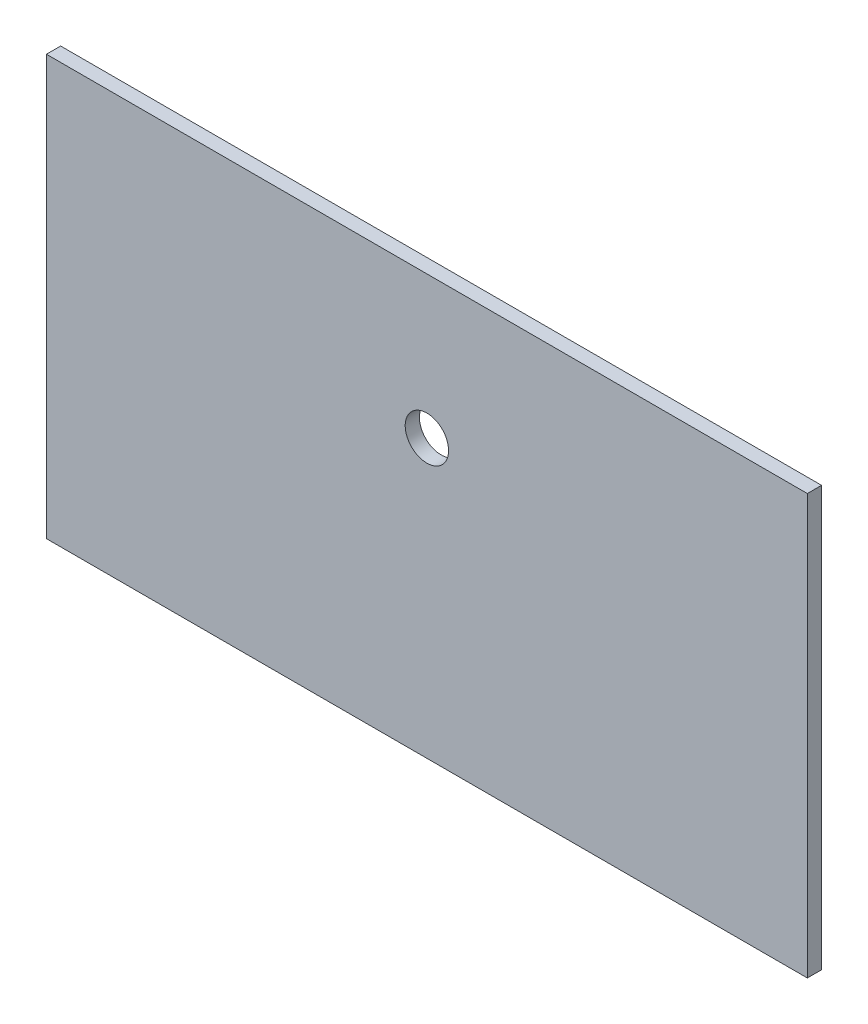
ISO-10303-21;
HEADER;
FILE_DESCRIPTION(('STEP AP214'),'2;1');
FILE_NAME('part.step','',(''),(''),'','','');
FILE_SCHEMA(('AUTOMOTIVE_DESIGN { 1 0 10303 214 1 1 1 1 }'));
ENDSEC;
DATA;
#1=APPLICATION_CONTEXT('core data for automotive mechanical design processes');
#2=APPLICATION_PROTOCOL_DEFINITION('international standard','automotive_design',2000,#1);
#3=PRODUCT_CONTEXT('',#1,'mechanical');
#4=PRODUCT('Part','Part','',(#3));
#5=PRODUCT_RELATED_PRODUCT_CATEGORY('part','',(#4));
#6=PRODUCT_DEFINITION_FORMATION('','',#4);
#7=PRODUCT_DEFINITION_CONTEXT('part definition',#1,'design');
#8=PRODUCT_DEFINITION('design','',#6,#7);
#9=PRODUCT_DEFINITION_SHAPE('','',#8);
#10=(LENGTH_UNIT() NAMED_UNIT(*) SI_UNIT(.MILLI.,.METRE.));
#11=(NAMED_UNIT(*) PLANE_ANGLE_UNIT() SI_UNIT($,.RADIAN.));
#12=(NAMED_UNIT(*) SI_UNIT($,.STERADIAN.) SOLID_ANGLE_UNIT());
#13=UNCERTAINTY_MEASURE_WITH_UNIT(LENGTH_MEASURE(1.E-05),#10,'distance_accuracy_value','');
#14=(GEOMETRIC_REPRESENTATION_CONTEXT(3) GLOBAL_UNCERTAINTY_ASSIGNED_CONTEXT((#13)) GLOBAL_UNIT_ASSIGNED_CONTEXT((#10,
#11,#12)) REPRESENTATION_CONTEXT('',''));
#15=CARTESIAN_POINT('',(0.,0.,0.));
#16=DIRECTION('',(0.,0.,1.));
#17=DIRECTION('',(1.,0.,0.));
#18=AXIS2_PLACEMENT_3D('',#15,#16,#17);
#19=CARTESIAN_POINT('',(0.,0.,2.));
#20=DIRECTION('',(0.,0.,-1.));
#21=DIRECTION('',(-1.,0.,0.));
#22=AXIS2_PLACEMENT_3D('',#19,#20,#21);
#23=PLANE('',#22);
#24=DIRECTION('',(0.,-1.,0.));
#25=VECTOR('',#24,1.);
#26=CARTESIAN_POINT('',(0.,0.,2.));
#27=LINE('',#26,#25);
#28=CARTESIAN_POINT('',(0.,59.,2.));
#29=VERTEX_POINT('',#28);
#30=CARTESIAN_POINT('',(0.,0.,2.));
#31=VERTEX_POINT('',#30);
#32=EDGE_CURVE('E85',#29,#31,#27,.T.);
#33=ORIENTED_EDGE('',*,*,#32,.T.);
#34=DIRECTION('',(1.,0.,0.));
#35=VECTOR('',#34,1.);
#36=CARTESIAN_POINT('',(0.,0.,2.));
#37=LINE('',#36,#35);
#38=CARTESIAN_POINT('',(107.,0.,2.));
#39=VERTEX_POINT('',#38);
#40=EDGE_CURVE('E80',#31,#39,#37,.T.);
#41=ORIENTED_EDGE('',*,*,#40,.T.);
#42=DIRECTION('',(0.,1.,0.));
#43=VECTOR('',#42,1.);
#44=CARTESIAN_POINT('',(107.,0.,2.));
#45=LINE('',#44,#43);
#46=CARTESIAN_POINT('',(107.,59.,2.));
#47=VERTEX_POINT('',#46);
#48=EDGE_CURVE('E83',#39,#47,#45,.T.);
#49=ORIENTED_EDGE('',*,*,#48,.T.);
#50=DIRECTION('',(-1.,0.,0.));
#51=VECTOR('',#50,1.);
#52=CARTESIAN_POINT('',(0.,59.,2.));
#53=LINE('',#52,#51);
#54=EDGE_CURVE('E50',#47,#29,#53,.T.);
#55=ORIENTED_EDGE('',*,*,#54,.T.);
#56=EDGE_LOOP('',(#33,#41,#49,#55));
#57=FACE_BOUND('',#56,.T.);
#58=CARTESIAN_POINT('',(53.5,39.,2.));
#59=DIRECTION('',(0.,0.,1.));
#60=DIRECTION('',(1.,0.,0.));
#61=AXIS2_PLACEMENT_3D('',#58,#59,#60);
#62=CIRCLE('',#61,3.05);
#63=CARTESIAN_POINT('',(56.55,39.,2.));
#64=VERTEX_POINT('',#63);
#65=EDGE_CURVE('E100',#64,#64,#62,.T.);
#66=ORIENTED_EDGE('',*,*,#65,.F.);
#67=EDGE_LOOP('',(#66));
#68=FACE_BOUND('',#67,.T.);
#69=ADVANCED_FACE('F33',(#57,#68),#23,.F.);
#70=CARTESIAN_POINT('',(0.,0.,0.));
#71=DIRECTION('',(0.,0.,-1.));
#72=DIRECTION('',(-1.,0.,0.));
#73=AXIS2_PLACEMENT_3D('',#70,#71,#72);
#74=PLANE('',#73);
#75=DIRECTION('',(0.,-1.,0.));
#76=VECTOR('',#75,1.);
#77=CARTESIAN_POINT('',(0.,0.,0.));
#78=LINE('',#77,#76);
#79=CARTESIAN_POINT('',(0.,59.,0.));
#80=VERTEX_POINT('',#79);
#81=CARTESIAN_POINT('',(0.,0.,0.));
#82=VERTEX_POINT('',#81);
#83=EDGE_CURVE('E97',#80,#82,#78,.T.);
#84=ORIENTED_EDGE('',*,*,#83,.F.);
#85=DIRECTION('',(-1.,0.,0.));
#86=VECTOR('',#85,1.);
#87=CARTESIAN_POINT('',(0.,59.,0.));
#88=LINE('',#87,#86);
#89=CARTESIAN_POINT('',(107.,59.,0.));
#90=VERTEX_POINT('',#89);
#91=EDGE_CURVE('E73',#90,#80,#88,.T.);
#92=ORIENTED_EDGE('',*,*,#91,.F.);
#93=DIRECTION('',(0.,1.,0.));
#94=VECTOR('',#93,1.);
#95=CARTESIAN_POINT('',(107.,0.,0.));
#96=LINE('',#95,#94);
#97=CARTESIAN_POINT('',(107.,0.,0.));
#98=VERTEX_POINT('',#97);
#99=EDGE_CURVE('E67',#98,#90,#96,.T.);
#100=ORIENTED_EDGE('',*,*,#99,.F.);
#101=DIRECTION('',(1.,0.,0.));
#102=VECTOR('',#101,1.);
#103=CARTESIAN_POINT('',(0.,0.,0.));
#104=LINE('',#103,#102);
#105=EDGE_CURVE('E89',#82,#98,#104,.T.);
#106=ORIENTED_EDGE('',*,*,#105,.F.);
#107=EDGE_LOOP('',(#84,#92,#100,#106));
#108=FACE_BOUND('',#107,.T.);
#109=CARTESIAN_POINT('',(53.5,39.,0.));
#110=DIRECTION('',(0.,0.,1.));
#111=DIRECTION('',(1.,0.,0.));
#112=AXIS2_PLACEMENT_3D('',#109,#110,#111);
#113=CIRCLE('',#112,3.05);
#114=CARTESIAN_POINT('',(56.55,39.,0.));
#115=VERTEX_POINT('',#114);
#116=EDGE_CURVE('E112',#115,#115,#113,.T.);
#117=ORIENTED_EDGE('',*,*,#116,.T.);
#118=EDGE_LOOP('',(#117));
#119=FACE_BOUND('',#118,.T.);
#120=ADVANCED_FACE('F108',(#108,#119),#74,.T.);
#121=CARTESIAN_POINT('',(0.,0.,2.));
#122=DIRECTION('',(1.,0.,0.));
#123=DIRECTION('',(0.,0.,-1.));
#124=AXIS2_PLACEMENT_3D('',#121,#122,#123);
#125=PLANE('',#124);
#126=ORIENTED_EDGE('',*,*,#83,.T.);
#127=DIRECTION('',(0.,0.,-1.));
#128=VECTOR('',#127,1.);
#129=CARTESIAN_POINT('',(0.,0.,2.));
#130=LINE('',#129,#128);
#131=EDGE_CURVE('E11',#31,#82,#130,.T.);
#132=ORIENTED_EDGE('',*,*,#131,.F.);
#133=ORIENTED_EDGE('',*,*,#32,.F.);
#134=DIRECTION('',(0.,0.,-1.));
#135=VECTOR('',#134,1.);
#136=CARTESIAN_POINT('',(0.,59.,2.));
#137=LINE('',#136,#135);
#138=EDGE_CURVE('E93',#29,#80,#137,.T.);
#139=ORIENTED_EDGE('',*,*,#138,.T.);
#140=EDGE_LOOP('',(#126,#132,#133,#139));
#141=FACE_BOUND('',#140,.T.);
#142=ADVANCED_FACE('F35',(#141),#125,.F.);
#143=CARTESIAN_POINT('',(0.,0.,2.));
#144=DIRECTION('',(0.,1.,0.));
#145=DIRECTION('',(0.,0.,1.));
#146=AXIS2_PLACEMENT_3D('',#143,#144,#145);
#147=PLANE('',#146);
#148=ORIENTED_EDGE('',*,*,#105,.T.);
#149=DIRECTION('',(0.,0.,-1.));
#150=VECTOR('',#149,1.);
#151=CARTESIAN_POINT('',(107.,0.,2.));
#152=LINE('',#151,#150);
#153=EDGE_CURVE('E42',#39,#98,#152,.T.);
#154=ORIENTED_EDGE('',*,*,#153,.F.);
#155=ORIENTED_EDGE('',*,*,#40,.F.);
#156=ORIENTED_EDGE('',*,*,#131,.T.);
#157=EDGE_LOOP('',(#148,#154,#155,#156));
#158=FACE_BOUND('',#157,.T.);
#159=ADVANCED_FACE('F88',(#158),#147,.F.);
#160=CARTESIAN_POINT('',(107.,0.,2.));
#161=DIRECTION('',(-1.,0.,0.));
#162=DIRECTION('',(0.,0.,1.));
#163=AXIS2_PLACEMENT_3D('',#160,#161,#162);
#164=PLANE('',#163);
#165=ORIENTED_EDGE('',*,*,#99,.T.);
#166=DIRECTION('',(0.,0.,-1.));
#167=VECTOR('',#166,1.);
#168=CARTESIAN_POINT('',(107.,59.,2.));
#169=LINE('',#168,#167);
#170=EDGE_CURVE('E90',#47,#90,#169,.T.);
#171=ORIENTED_EDGE('',*,*,#170,.F.);
#172=ORIENTED_EDGE('',*,*,#48,.F.);
#173=ORIENTED_EDGE('',*,*,#153,.T.);
#174=EDGE_LOOP('',(#165,#171,#172,#173));
#175=FACE_BOUND('',#174,.T.);
#176=ADVANCED_FACE('F91',(#175),#164,.F.);
#177=CARTESIAN_POINT('',(0.,59.,2.));
#178=DIRECTION('',(0.,-1.,0.));
#179=DIRECTION('',(0.,0.,-1.));
#180=AXIS2_PLACEMENT_3D('',#177,#178,#179);
#181=PLANE('',#180);
#182=ORIENTED_EDGE('',*,*,#91,.T.);
#183=ORIENTED_EDGE('',*,*,#138,.F.);
#184=ORIENTED_EDGE('',*,*,#54,.F.);
#185=ORIENTED_EDGE('',*,*,#170,.T.);
#186=EDGE_LOOP('',(#182,#183,#184,#185));
#187=FACE_BOUND('',#186,.T.);
#188=ADVANCED_FACE('F105',(#187),#181,.F.);
#189=CARTESIAN_POINT('',(53.5,39.,2.));
#190=DIRECTION('',(0.,0.,-1.));
#191=DIRECTION('',(-1.,0.,0.));
#192=AXIS2_PLACEMENT_3D('',#189,#190,#191);
#193=CYLINDRICAL_SURFACE('',#192,3.05);
#194=ORIENTED_EDGE('',*,*,#65,.T.);
#195=EDGE_LOOP('',(#194));
#196=FACE_BOUND('',#195,.T.);
#197=ORIENTED_EDGE('',*,*,#116,.F.);
#198=EDGE_LOOP('',(#197));
#199=FACE_BOUND('',#198,.T.);
#200=ADVANCED_FACE('F118',(#196,#199),#193,.F.);
#201=CLOSED_SHELL('',(#69,#120,#142,#159,#176,#188,#200));
#202=MANIFOLD_SOLID_BREP('B2',#201);
#203=ADVANCED_BREP_SHAPE_REPRESENTATION('',(#18,#202),#14);
#204=SHAPE_DEFINITION_REPRESENTATION(#9,#203);
ENDSEC;
END-ISO-10303-21;
